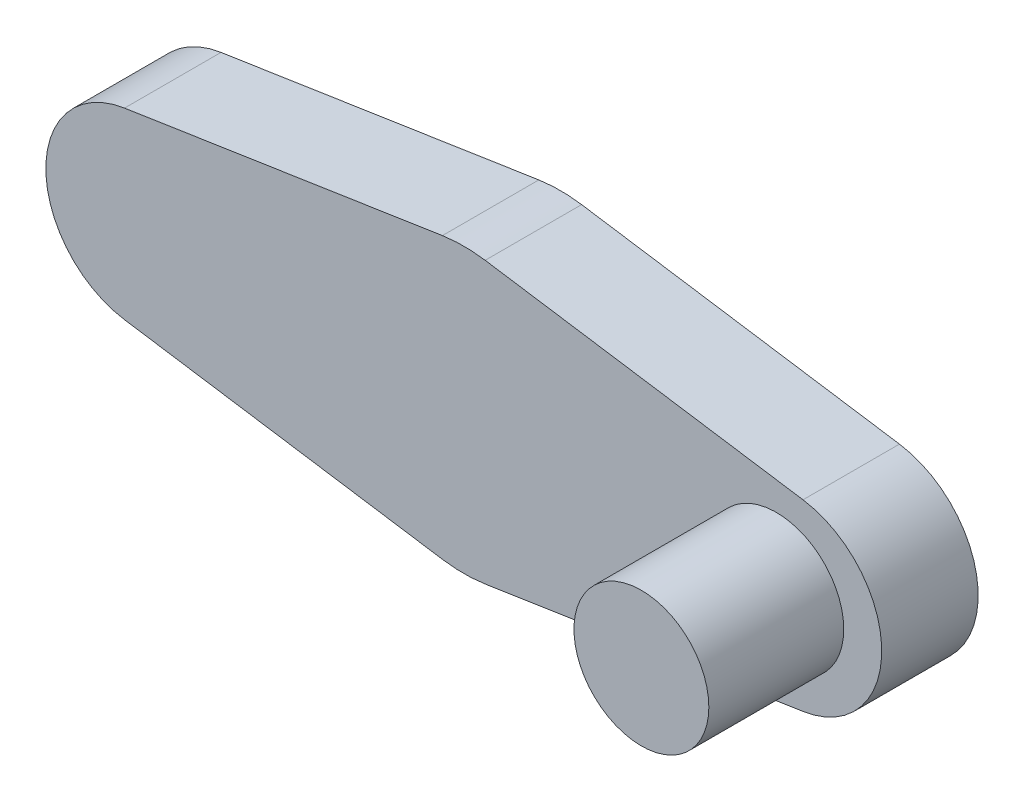
ISO-10303-21;
HEADER;
FILE_DESCRIPTION(('STEP AP214'),'2;1');
FILE_NAME('part.step','',(''),(''),'','','');
FILE_SCHEMA(('AUTOMOTIVE_DESIGN { 1 0 10303 214 1 1 1 1 }'));
ENDSEC;
DATA;
#1=APPLICATION_CONTEXT('core data for automotive mechanical design processes');
#2=APPLICATION_PROTOCOL_DEFINITION('international standard','automotive_design',2000,#1);
#3=PRODUCT_CONTEXT('',#1,'mechanical');
#4=PRODUCT('Part','Part','',(#3));
#5=PRODUCT_RELATED_PRODUCT_CATEGORY('part','',(#4));
#6=PRODUCT_DEFINITION_FORMATION('','',#4);
#7=PRODUCT_DEFINITION_CONTEXT('part definition',#1,'design');
#8=PRODUCT_DEFINITION('design','',#6,#7);
#9=PRODUCT_DEFINITION_SHAPE('','',#8);
#10=(LENGTH_UNIT() NAMED_UNIT(*) SI_UNIT(.MILLI.,.METRE.));
#11=(NAMED_UNIT(*) PLANE_ANGLE_UNIT() SI_UNIT($,.RADIAN.));
#12=(NAMED_UNIT(*) SI_UNIT($,.STERADIAN.) SOLID_ANGLE_UNIT());
#13=UNCERTAINTY_MEASURE_WITH_UNIT(LENGTH_MEASURE(1.E-05),#10,'distance_accuracy_value','');
#14=(GEOMETRIC_REPRESENTATION_CONTEXT(3) GLOBAL_UNCERTAINTY_ASSIGNED_CONTEXT((#13)) GLOBAL_UNIT_ASSIGNED_CONTEXT((#10,
#11,#12)) REPRESENTATION_CONTEXT('',''));
#15=CARTESIAN_POINT('',(0.,0.,0.));
#16=DIRECTION('',(0.,0.,1.));
#17=DIRECTION('',(1.,0.,0.));
#18=AXIS2_PLACEMENT_3D('',#15,#16,#17);
#19=CARTESIAN_POINT('',(-0.509415328671595,-3.3334105627571,2.));
#20=DIRECTION('',(-0.151067206207441,-0.988523494515269,0.));
#21=DIRECTION('',(0.988523494515269,-0.151067206207441,0.));
#22=AXIS2_PLACEMENT_3D('',#19,#20,#21);
#23=PLANE('',#22);
#24=DIRECTION('',(-0.988523494515269,0.151067206207441,0.));
#25=VECTOR('',#24,1.);
#26=CARTESIAN_POINT('',(-0.509415328671595,-3.3334105627571,0.));
#27=LINE('',#26,#25);
#28=CARTESIAN_POINT('',(4.42533710233228,-4.08754464982064,0.));
#29=VERTEX_POINT('',#28);
#30=CARTESIAN_POINT('',(-10.5365026242203,-1.80106047442719,0.));
#31=VERTEX_POINT('',#30);
#32=EDGE_CURVE('E135',#29,#31,#27,.T.);
#33=ORIENTED_EDGE('',*,*,#32,.T.);
#34=DIRECTION('',(0.,0.,-1.));
#35=VECTOR('',#34,1.);
#36=CARTESIAN_POINT('',(-10.5365026242203,-1.80106047442719,2.));
#37=LINE('',#36,#35);
#38=CARTESIAN_POINT('',(-10.5365026242203,-1.80106047442719,2.));
#39=VERTEX_POINT('',#38);
#40=EDGE_CURVE('E11',#39,#31,#37,.T.);
#41=ORIENTED_EDGE('',*,*,#40,.F.);
#42=DIRECTION('',(-0.988523494515269,0.151067206207441,0.));
#43=VECTOR('',#42,1.);
#44=CARTESIAN_POINT('',(-0.509415328671595,-3.3334105627571,2.));
#45=LINE('',#44,#43);
#46=CARTESIAN_POINT('',(4.42533710233228,-4.08754464982064,2.));
#47=VERTEX_POINT('',#46);
#48=EDGE_CURVE('E136',#47,#39,#45,.T.);
#49=ORIENTED_EDGE('',*,*,#48,.F.);
#50=DIRECTION('',(0.,0.,-1.));
#51=VECTOR('',#50,1.);
#52=CARTESIAN_POINT('',(4.42533710233228,-4.08754464982064,2.));
#53=LINE('',#52,#51);
#54=EDGE_CURVE('E121',#47,#29,#53,.T.);
#55=ORIENTED_EDGE('',*,*,#54,.T.);
#56=EDGE_LOOP('',(#33,#41,#49,#55));
#57=FACE_BOUND('',#56,.T.);
#58=ADVANCED_FACE('F41',(#57),#23,.F.);
#59=CARTESIAN_POINT('',(-10.2609482374131,0.00205743722317206,2.));
#60=DIRECTION('',(0.,0.,-1.));
#61=DIRECTION('',(-1.,0.,0.));
#62=AXIS2_PLACEMENT_3D('',#59,#60,#61);
#63=CYLINDRICAL_SURFACE('',#62,1.82405165042085);
#64=CARTESIAN_POINT('',(-10.2609482374131,0.00205743722317206,0.));
#65=DIRECTION('',(0.,0.,1.));
#66=DIRECTION('',(1.,0.,0.));
#67=AXIS2_PLACEMENT_3D('',#64,#65,#66);
#68=CIRCLE('',#67,1.82405165042085);
#69=CARTESIAN_POINT('',(-10.5360180196135,1.80524934002311,0.));
#70=VERTEX_POINT('',#69);
#71=EDGE_CURVE('E213',#31,#70,#68,.F.);
#72=ORIENTED_EDGE('',*,*,#71,.T.);
#73=DIRECTION('',(0.,0.,-1.));
#74=VECTOR('',#73,1.);
#75=CARTESIAN_POINT('',(-10.5360180196135,1.80524934002311,2.));
#76=LINE('',#75,#74);
#77=CARTESIAN_POINT('',(-10.5360180196135,1.80524934002311,2.));
#78=VERTEX_POINT('',#77);
#79=EDGE_CURVE('E51',#78,#70,#76,.T.);
#80=ORIENTED_EDGE('',*,*,#79,.F.);
#81=CARTESIAN_POINT('',(-10.2609482374131,0.00205743722317206,2.));
#82=DIRECTION('',(0.,0.,1.));
#83=DIRECTION('',(1.,0.,0.));
#84=AXIS2_PLACEMENT_3D('',#81,#82,#83);
#85=CIRCLE('',#84,1.82405165042085);
#86=EDGE_CURVE('E139',#39,#78,#85,.F.);
#87=ORIENTED_EDGE('',*,*,#86,.F.);
#88=ORIENTED_EDGE('',*,*,#40,.T.);
#89=EDGE_LOOP('',(#72,#80,#87,#88));
#90=FACE_BOUND('',#89,.T.);
#91=ADVANCED_FACE('F254',(#90),#63,.F.);
#92=CARTESIAN_POINT('',(-0.508721767831144,3.33487366439654,2.));
#93=DIRECTION('',(-0.150801531380359,0.988564058689845,0.));
#94=DIRECTION('',(-0.988564058689845,-0.150801531380359,0.));
#95=AXIS2_PLACEMENT_3D('',#92,#93,#94);
#96=PLANE('',#95);
#97=DIRECTION('',(0.988564058689845,0.150801531380359,0.));
#98=VECTOR('',#97,1.);
#99=CARTESIAN_POINT('',(-0.508721767831144,3.33487366439654,0.));
#100=LINE('',#99,#98);
#101=CARTESIAN_POINT('',(4.42643566774227,4.08771238268251,0.));
#102=VERTEX_POINT('',#101);
#103=EDGE_CURVE('E215',#70,#102,#100,.T.);
#104=ORIENTED_EDGE('',*,*,#103,.T.);
#105=DIRECTION('',(0.,0.,-1.));
#106=VECTOR('',#105,1.);
#107=CARTESIAN_POINT('',(4.42643566774227,4.08771238268251,2.));
#108=LINE('',#107,#106);
#109=CARTESIAN_POINT('',(4.42643566774227,4.08771238268251,2.));
#110=VERTEX_POINT('',#109);
#111=EDGE_CURVE('E149',#110,#102,#108,.T.);
#112=ORIENTED_EDGE('',*,*,#111,.F.);
#113=DIRECTION('',(0.988564058689845,0.150801531380359,0.));
#114=VECTOR('',#113,1.);
#115=CARTESIAN_POINT('',(-0.508721767831144,3.33487366439654,2.));
#116=LINE('',#115,#114);
#117=EDGE_CURVE('E251',#78,#110,#116,.T.);
#118=ORIENTED_EDGE('',*,*,#117,.F.);
#119=ORIENTED_EDGE('',*,*,#79,.T.);
#120=EDGE_LOOP('',(#104,#112,#118,#119));
#121=FACE_BOUND('',#120,.T.);
#122=ADVANCED_FACE('F245',(#121),#96,.F.);
#123=CARTESIAN_POINT('',(5.05000000000001,0.,2.));
#124=DIRECTION('',(0.,0.,-1.));
#125=DIRECTION('',(-1.,0.,0.));
#126=AXIS2_PLACEMENT_3D('',#123,#124,#125);
#127=CYLINDRICAL_SURFACE('',#126,4.135);
#128=CARTESIAN_POINT('',(5.05000000000001,0.,0.));
#129=DIRECTION('',(0.,0.,1.));
#130=DIRECTION('',(1.,0.,0.));
#131=AXIS2_PLACEMENT_3D('',#128,#129,#130);
#132=CIRCLE('',#131,4.135);
#133=CARTESIAN_POINT('',(5.67356433225773,4.08771238268252,0.));
#134=VERTEX_POINT('',#133);
#135=EDGE_CURVE('E218',#134,#102,#132,.T.);
#136=ORIENTED_EDGE('',*,*,#135,.F.);
#137=DIRECTION('',(0.,0.,-1.));
#138=VECTOR('',#137,1.);
#139=CARTESIAN_POINT('',(5.67356433225773,4.08771238268252,2.));
#140=LINE('',#139,#138);
#141=CARTESIAN_POINT('',(5.67356433225773,4.08771238268252,2.));
#142=VERTEX_POINT('',#141);
#143=EDGE_CURVE('E147',#142,#134,#140,.T.);
#144=ORIENTED_EDGE('',*,*,#143,.F.);
#145=CARTESIAN_POINT('',(5.05000000000001,0.,2.));
#146=DIRECTION('',(0.,0.,1.));
#147=DIRECTION('',(1.,0.,0.));
#148=AXIS2_PLACEMENT_3D('',#145,#146,#147);
#149=CIRCLE('',#148,4.135);
#150=EDGE_CURVE('E318',#142,#110,#149,.T.);
#151=ORIENTED_EDGE('',*,*,#150,.T.);
#152=ORIENTED_EDGE('',*,*,#111,.T.);
#153=EDGE_LOOP('',(#136,#144,#151,#152));
#154=FACE_BOUND('',#153,.T.);
#155=ADVANCED_FACE('F241',(#154),#127,.F.);
#156=CARTESIAN_POINT('',(0.738406896684348,4.84055110096841,2.));
#157=DIRECTION('',(-0.150801531380345,-0.988564058689847,0.));
#158=DIRECTION('',(0.988564058689847,-0.150801531380345,0.));
#159=AXIS2_PLACEMENT_3D('',#156,#157,#158);
#160=PLANE('',#159);
#161=DIRECTION('',(-0.988564058689847,0.150801531380345,0.));
#162=VECTOR('',#161,1.);
#163=CARTESIAN_POINT('',(0.738406896684348,4.84055110096841,0.));
#164=LINE('',#163,#162);
#165=CARTESIAN_POINT('',(20.6360180196135,1.80524934002333,0.));
#166=VERTEX_POINT('',#165);
#167=EDGE_CURVE('E221',#166,#134,#164,.T.);
#168=ORIENTED_EDGE('',*,*,#167,.F.);
#169=DIRECTION('',(0.,0.,-1.));
#170=VECTOR('',#169,1.);
#171=CARTESIAN_POINT('',(20.6360180196135,1.80524934002333,2.));
#172=LINE('',#171,#170);
#173=CARTESIAN_POINT('',(20.6360180196135,1.80524934002333,2.));
#174=VERTEX_POINT('',#173);
#175=EDGE_CURVE('E145',#174,#166,#172,.T.);
#176=ORIENTED_EDGE('',*,*,#175,.F.);
#177=DIRECTION('',(-0.988564058689847,0.150801531380345,0.));
#178=VECTOR('',#177,1.);
#179=CARTESIAN_POINT('',(0.738406896684348,4.84055110096841,2.));
#180=LINE('',#179,#178);
#181=EDGE_CURVE('E238',#174,#142,#180,.T.);
#182=ORIENTED_EDGE('',*,*,#181,.T.);
#183=ORIENTED_EDGE('',*,*,#143,.T.);
#184=EDGE_LOOP('',(#168,#176,#182,#183));
#185=FACE_BOUND('',#184,.T.);
#186=ADVANCED_FACE('F233',(#185),#160,.T.);
#187=CARTESIAN_POINT('',(20.3609482374132,0.00205743722338716,2.));
#188=DIRECTION('',(0.,0.,-1.));
#189=DIRECTION('',(-1.,0.,0.));
#190=AXIS2_PLACEMENT_3D('',#187,#188,#189);
#191=CYLINDRICAL_SURFACE('',#190,1.82405165042085);
#192=CARTESIAN_POINT('',(20.3609482374132,0.00205743722338716,0.));
#193=DIRECTION('',(0.,0.,1.));
#194=DIRECTION('',(1.,0.,0.));
#195=AXIS2_PLACEMENT_3D('',#192,#193,#194);
#196=CIRCLE('',#195,1.82405165042085);
#197=CARTESIAN_POINT('',(20.6365026242203,-1.80106047442697,0.));
#198=VERTEX_POINT('',#197);
#199=EDGE_CURVE('E130',#198,#166,#196,.T.);
#200=ORIENTED_EDGE('',*,*,#199,.F.);
#201=DIRECTION('',(0.,0.,-1.));
#202=VECTOR('',#201,1.);
#203=CARTESIAN_POINT('',(20.6365026242203,-1.80106047442697,2.));
#204=LINE('',#203,#202);
#205=CARTESIAN_POINT('',(20.6365026242203,-1.80106047442697,2.));
#206=VERTEX_POINT('',#205);
#207=EDGE_CURVE('E120',#206,#198,#204,.T.);
#208=ORIENTED_EDGE('',*,*,#207,.F.);
#209=CARTESIAN_POINT('',(20.3609482374132,0.00205743722338716,2.));
#210=DIRECTION('',(0.,0.,1.));
#211=DIRECTION('',(1.,0.,0.));
#212=AXIS2_PLACEMENT_3D('',#209,#210,#211);
#213=CIRCLE('',#212,1.82405165042085);
#214=EDGE_CURVE('E230',#206,#174,#213,.T.);
#215=ORIENTED_EDGE('',*,*,#214,.T.);
#216=ORIENTED_EDGE('',*,*,#175,.T.);
#217=EDGE_LOOP('',(#200,#208,#215,#216));
#218=FACE_BOUND('',#217,.T.);
#219=ADVANCED_FACE('F225',(#218),#191,.F.);
#220=CARTESIAN_POINT('',(0.739910466664021,-4.84167873688423,2.));
#221=DIRECTION('',(-0.151067206207455,0.988523494515267,0.));
#222=DIRECTION('',(-0.988523494515267,-0.151067206207455,0.));
#223=AXIS2_PLACEMENT_3D('',#220,#221,#222);
#224=PLANE('',#223);
#225=DIRECTION('',(0.988523494515267,0.151067206207455,0.));
#226=VECTOR('',#225,1.);
#227=CARTESIAN_POINT('',(0.739910466664021,-4.84167873688423,0.));
#228=LINE('',#227,#226);
#229=CARTESIAN_POINT('',(5.67466289766783,-4.08754464982063,0.));
#230=VERTEX_POINT('',#229);
#231=EDGE_CURVE('E124',#230,#198,#228,.T.);
#232=ORIENTED_EDGE('',*,*,#231,.F.);
#233=DIRECTION('',(0.,0.,-1.));
#234=VECTOR('',#233,1.);
#235=CARTESIAN_POINT('',(5.67466289766783,-4.08754464982063,2.));
#236=LINE('',#235,#234);
#237=CARTESIAN_POINT('',(5.67466289766783,-4.08754464982063,2.));
#238=VERTEX_POINT('',#237);
#239=EDGE_CURVE('E112',#238,#230,#236,.T.);
#240=ORIENTED_EDGE('',*,*,#239,.F.);
#241=DIRECTION('',(0.988523494515267,0.151067206207455,0.));
#242=VECTOR('',#241,1.);
#243=CARTESIAN_POINT('',(0.739910466664021,-4.84167873688423,2.));
#244=LINE('',#243,#242);
#245=EDGE_CURVE('E59',#238,#206,#244,.T.);
#246=ORIENTED_EDGE('',*,*,#245,.T.);
#247=ORIENTED_EDGE('',*,*,#207,.T.);
#248=EDGE_LOOP('',(#232,#240,#246,#247));
#249=FACE_BOUND('',#248,.T.);
#250=ADVANCED_FACE('F125',(#249),#224,.T.);
#251=CARTESIAN_POINT('',(-10.2609482374131,0.00205743722317206,2.));
#252=DIRECTION('',(0.,0.,-1.));
#253=DIRECTION('',(-1.,0.,0.));
#254=AXIS2_PLACEMENT_3D('',#251,#252,#253);
#255=CYLINDRICAL_SURFACE('',#254,4.36405165042085);
#256=CARTESIAN_POINT('',(-10.2609482374131,0.00205743722317206,0.));
#257=DIRECTION('',(0.,0.,1.));
#258=DIRECTION('',(1.,0.,0.));
#259=AXIS2_PLACEMENT_3D('',#256,#257,#258);
#260=CIRCLE('',#259,4.36405165042085);
#261=CARTESIAN_POINT('',(-10.9202133279872,-4.31191015049597,0.));
#262=VERTEX_POINT('',#261);
#263=CARTESIAN_POINT('',(-10.9190539093196,4.31620204909532,0.));
#264=VERTEX_POINT('',#263);
#265=EDGE_CURVE('E188',#262,#264,#260,.F.);
#266=ORIENTED_EDGE('',*,*,#265,.F.);
#267=DIRECTION('',(0.,0.,-1.));
#268=VECTOR('',#267,1.);
#269=CARTESIAN_POINT('',(-10.9202133279872,-4.31191015049597,2.));
#270=LINE('',#269,#268);
#271=CARTESIAN_POINT('',(-10.9202133279872,-4.31191015049597,4.54));
#272=VERTEX_POINT('',#271);
#273=EDGE_CURVE('E45',#272,#262,#270,.T.);
#274=ORIENTED_EDGE('',*,*,#273,.F.);
#275=CARTESIAN_POINT('',(-10.2609482374131,0.00205743722317206,4.54));
#276=DIRECTION('',(0.,0.,1.));
#277=DIRECTION('',(1.,0.,0.));
#278=AXIS2_PLACEMENT_3D('',#275,#276,#277);
#279=CIRCLE('',#278,4.36405165042085);
#280=CARTESIAN_POINT('',(-10.9190539093196,4.31620204909532,4.54));
#281=VERTEX_POINT('',#280);
#282=EDGE_CURVE('E289',#281,#272,#279,.T.);
#283=ORIENTED_EDGE('',*,*,#282,.F.);
#284=DIRECTION('',(0.,0.,-1.));
#285=VECTOR('',#284,1.);
#286=CARTESIAN_POINT('',(-10.9190539093196,4.31620204909532,2.));
#287=LINE('',#286,#285);
#288=EDGE_CURVE('E153',#281,#264,#287,.T.);
#289=ORIENTED_EDGE('',*,*,#288,.T.);
#290=EDGE_LOOP('',(#266,#274,#283,#289));
#291=FACE_BOUND('',#290,.T.);
#292=ADVANCED_FACE('F43',(#291),#255,.T.);
#293=CARTESIAN_POINT('',(-0.893126032438493,-5.84426023882588,2.));
#294=DIRECTION('',(-0.151067206207441,-0.988523494515269,0.));
#295=DIRECTION('',(0.988523494515269,-0.151067206207441,0.));
#296=AXIS2_PLACEMENT_3D('',#293,#294,#295);
#297=PLANE('',#296);
#298=DIRECTION('',(-0.988523494515269,0.151067206207441,0.));
#299=VECTOR('',#298,1.);
#300=CARTESIAN_POINT('',(-0.893126032438493,-5.84426023882588,0.));
#301=LINE('',#300,#299);
#302=CARTESIAN_POINT('',(4.04162639856539,-6.59839432588942,0.));
#303=VERTEX_POINT('',#302);
#304=EDGE_CURVE('E180',#303,#262,#301,.T.);
#305=ORIENTED_EDGE('',*,*,#304,.F.);
#306=DIRECTION('',(0.,0.,-1.));
#307=VECTOR('',#306,1.);
#308=CARTESIAN_POINT('',(4.04162639856539,-6.59839432588942,2.));
#309=LINE('',#308,#307);
#310=CARTESIAN_POINT('',(4.04162639856538,-6.59839432588942,4.54));
#311=VERTEX_POINT('',#310);
#312=EDGE_CURVE('E168',#311,#303,#309,.T.);
#313=ORIENTED_EDGE('',*,*,#312,.F.);
#314=DIRECTION('',(0.988523494515269,-0.151067206207441,0.));
#315=VECTOR('',#314,1.);
#316=CARTESIAN_POINT('',(-0.893126032438493,-5.84426023882588,4.54));
#317=LINE('',#316,#315);
#318=EDGE_CURVE('E183',#272,#311,#317,.T.);
#319=ORIENTED_EDGE('',*,*,#318,.F.);
#320=ORIENTED_EDGE('',*,*,#273,.T.);
#321=EDGE_LOOP('',(#305,#313,#319,#320));
#322=FACE_BOUND('',#321,.T.);
#323=ADVANCED_FACE('F178',(#322),#297,.T.);
#324=CARTESIAN_POINT('',(5.05000000000001,0.,2.));
#325=DIRECTION('',(0.,0.,-1.));
#326=DIRECTION('',(-1.,0.,0.));
#327=AXIS2_PLACEMENT_3D('',#324,#325,#326);
#328=CYLINDRICAL_SURFACE('',#327,6.675);
#329=CARTESIAN_POINT('',(5.05000000000001,0.,0.));
#330=DIRECTION('',(0.,0.,1.));
#331=DIRECTION('',(1.,0.,0.));
#332=AXIS2_PLACEMENT_3D('',#329,#330,#331);
#333=CIRCLE('',#332,6.675);
#334=CARTESIAN_POINT('',(6.05837360143477,-6.59839432588941,0.));
#335=VERTEX_POINT('',#334);
#336=EDGE_CURVE('E196',#303,#335,#333,.T.);
#337=ORIENTED_EDGE('',*,*,#336,.T.);
#338=DIRECTION('',(0.,0.,-1.));
#339=VECTOR('',#338,1.);
#340=CARTESIAN_POINT('',(6.05837360143477,-6.59839432588941,2.));
#341=LINE('',#340,#339);
#342=CARTESIAN_POINT('',(6.05837360143477,-6.59839432588941,4.54));
#343=VERTEX_POINT('',#342);
#344=EDGE_CURVE('E166',#343,#335,#341,.T.);
#345=ORIENTED_EDGE('',*,*,#344,.F.);
#346=CARTESIAN_POINT('',(5.05000000000001,0.,4.54));
#347=DIRECTION('',(0.,0.,1.));
#348=DIRECTION('',(1.,0.,0.));
#349=AXIS2_PLACEMENT_3D('',#346,#347,#348);
#350=CIRCLE('',#349,6.675);
#351=EDGE_CURVE('E304',#311,#343,#350,.T.);
#352=ORIENTED_EDGE('',*,*,#351,.F.);
#353=ORIENTED_EDGE('',*,*,#312,.T.);
#354=EDGE_LOOP('',(#337,#345,#352,#353));
#355=FACE_BOUND('',#354,.T.);
#356=ADVANCED_FACE('F360',(#355),#328,.T.);
#357=CARTESIAN_POINT('',(1.12362117043096,-7.35252841295301,2.));
#358=DIRECTION('',(-0.151067206207455,0.988523494515267,0.));
#359=DIRECTION('',(-0.988523494515267,-0.151067206207455,0.));
#360=AXIS2_PLACEMENT_3D('',#357,#358,#359);
#361=PLANE('',#360);
#362=DIRECTION('',(0.988523494515267,0.151067206207455,0.));
#363=VECTOR('',#362,1.);
#364=CARTESIAN_POINT('',(1.12362117043096,-7.35252841295301,0.));
#365=LINE('',#364,#363);
#366=CARTESIAN_POINT('',(21.0202133279873,-4.31191015049575,0.));
#367=VERTEX_POINT('',#366);
#368=EDGE_CURVE('E198',#335,#367,#365,.T.);
#369=ORIENTED_EDGE('',*,*,#368,.T.);
#370=DIRECTION('',(0.,0.,-1.));
#371=VECTOR('',#370,1.);
#372=CARTESIAN_POINT('',(21.0202133279873,-4.31191015049575,2.));
#373=LINE('',#372,#371);
#374=CARTESIAN_POINT('',(21.0202133279873,-4.31191015049575,4.54));
#375=VERTEX_POINT('',#374);
#376=EDGE_CURVE('E163',#375,#367,#373,.T.);
#377=ORIENTED_EDGE('',*,*,#376,.F.);
#378=DIRECTION('',(0.988523494515267,0.151067206207455,0.));
#379=VECTOR('',#378,1.);
#380=CARTESIAN_POINT('',(1.12362117043096,-7.35252841295301,4.54));
#381=LINE('',#380,#379);
#382=EDGE_CURVE('E307',#343,#375,#381,.T.);
#383=ORIENTED_EDGE('',*,*,#382,.F.);
#384=ORIENTED_EDGE('',*,*,#344,.T.);
#385=EDGE_LOOP('',(#369,#377,#383,#384));
#386=FACE_BOUND('',#385,.T.);
#387=ADVANCED_FACE('F356',(#386),#361,.F.);
#388=CARTESIAN_POINT('',(20.3609482374132,0.00205743722338716,2.));
#389=DIRECTION('',(0.,0.,-1.));
#390=DIRECTION('',(-1.,0.,0.));
#391=AXIS2_PLACEMENT_3D('',#388,#389,#390);
#392=CYLINDRICAL_SURFACE('',#391,4.36405165042085);
#393=CARTESIAN_POINT('',(20.3609482374132,0.00205743722338716,0.));
#394=DIRECTION('',(0.,0.,1.));
#395=DIRECTION('',(1.,0.,0.));
#396=AXIS2_PLACEMENT_3D('',#393,#394,#395);
#397=CIRCLE('',#396,4.36405165042085);
#398=CARTESIAN_POINT('',(21.0190539093196,4.31620204909554,0.));
#399=VERTEX_POINT('',#398);
#400=EDGE_CURVE('E203',#367,#399,#397,.T.);
#401=ORIENTED_EDGE('',*,*,#400,.T.);
#402=DIRECTION('',(0.,0.,-1.));
#403=VECTOR('',#402,1.);
#404=CARTESIAN_POINT('',(21.0190539093196,4.31620204909554,2.));
#405=LINE('',#404,#403);
#406=CARTESIAN_POINT('',(21.0190539093196,4.31620204909554,4.54));
#407=VERTEX_POINT('',#406);
#408=EDGE_CURVE('E160',#407,#399,#405,.T.);
#409=ORIENTED_EDGE('',*,*,#408,.F.);
#410=CARTESIAN_POINT('',(20.3609482374132,0.00205743722338716,4.54));
#411=DIRECTION('',(0.,0.,1.));
#412=DIRECTION('',(1.,0.,0.));
#413=AXIS2_PLACEMENT_3D('',#410,#411,#412);
#414=CIRCLE('',#413,4.36405165042085);
#415=EDGE_CURVE('E310',#375,#407,#414,.T.);
#416=ORIENTED_EDGE('',*,*,#415,.F.);
#417=ORIENTED_EDGE('',*,*,#376,.T.);
#418=EDGE_LOOP('',(#401,#409,#416,#417));
#419=FACE_BOUND('',#418,.T.);
#420=ADVANCED_FACE('F352',(#419),#392,.T.);
#421=CARTESIAN_POINT('',(1.12144278639042,7.35150381004062,2.));
#422=DIRECTION('',(-0.150801531380345,-0.988564058689847,0.));
#423=DIRECTION('',(0.988564058689847,-0.150801531380345,0.));
#424=AXIS2_PLACEMENT_3D('',#421,#422,#423);
#425=PLANE('',#424);
#426=DIRECTION('',(-0.988564058689847,0.150801531380345,0.));
#427=VECTOR('',#426,1.);
#428=CARTESIAN_POINT('',(1.12144278639042,7.35150381004062,0.));
#429=LINE('',#428,#427);
#430=CARTESIAN_POINT('',(6.05660022196381,6.59866509175473,0.));
#431=VERTEX_POINT('',#430);
#432=EDGE_CURVE('E205',#399,#431,#429,.T.);
#433=ORIENTED_EDGE('',*,*,#432,.T.);
#434=DIRECTION('',(0.,0.,-1.));
#435=VECTOR('',#434,1.);
#436=CARTESIAN_POINT('',(6.05660022196381,6.59866509175473,2.));
#437=LINE('',#436,#435);
#438=CARTESIAN_POINT('',(6.05660022196381,6.59866509175473,4.54));
#439=VERTEX_POINT('',#438);
#440=EDGE_CURVE('E157',#439,#431,#437,.T.);
#441=ORIENTED_EDGE('',*,*,#440,.F.);
#442=DIRECTION('',(-0.988564058689847,0.150801531380345,0.));
#443=VECTOR('',#442,1.);
#444=CARTESIAN_POINT('',(1.12144278639042,7.35150381004062,4.54));
#445=LINE('',#444,#443);
#446=EDGE_CURVE('E313',#407,#439,#445,.T.);
#447=ORIENTED_EDGE('',*,*,#446,.F.);
#448=ORIENTED_EDGE('',*,*,#408,.T.);
#449=EDGE_LOOP('',(#433,#441,#447,#448));
#450=FACE_BOUND('',#449,.T.);
#451=ADVANCED_FACE('F348',(#450),#425,.F.);
#452=CARTESIAN_POINT('',(5.05000000000001,0.,2.));
#453=DIRECTION('',(0.,0.,-1.));
#454=DIRECTION('',(-1.,0.,0.));
#455=AXIS2_PLACEMENT_3D('',#452,#453,#454);
#456=CYLINDRICAL_SURFACE('',#455,6.675);
#457=CARTESIAN_POINT('',(5.05000000000001,0.,0.));
#458=DIRECTION('',(0.,0.,1.));
#459=DIRECTION('',(1.,0.,0.));
#460=AXIS2_PLACEMENT_3D('',#457,#458,#459);
#461=CIRCLE('',#460,6.675);
#462=CARTESIAN_POINT('',(4.04339977803616,6.59866509175472,0.));
#463=VERTEX_POINT('',#462);
#464=EDGE_CURVE('E207',#431,#463,#461,.T.);
#465=ORIENTED_EDGE('',*,*,#464,.T.);
#466=DIRECTION('',(0.,0.,-1.));
#467=VECTOR('',#466,1.);
#468=CARTESIAN_POINT('',(4.04339977803616,6.59866509175472,2.));
#469=LINE('',#468,#467);
#470=CARTESIAN_POINT('',(4.04339977803616,6.59866509175472,4.54));
#471=VERTEX_POINT('',#470);
#472=EDGE_CURVE('E155',#471,#463,#469,.T.);
#473=ORIENTED_EDGE('',*,*,#472,.F.);
#474=CARTESIAN_POINT('',(5.05000000000001,0.,4.54));
#475=DIRECTION('',(0.,0.,1.));
#476=DIRECTION('',(1.,0.,0.));
#477=AXIS2_PLACEMENT_3D('',#474,#475,#476);
#478=CIRCLE('',#477,6.675);
#479=EDGE_CURVE('E193',#439,#471,#478,.T.);
#480=ORIENTED_EDGE('',*,*,#479,.F.);
#481=ORIENTED_EDGE('',*,*,#440,.T.);
#482=EDGE_LOOP('',(#465,#473,#480,#481));
#483=FACE_BOUND('',#482,.T.);
#484=ADVANCED_FACE('F345',(#483),#456,.T.);
#485=CARTESIAN_POINT('',(-0.891757657537256,5.84582637346875,2.));
#486=DIRECTION('',(-0.150801531380359,0.988564058689845,0.));
#487=DIRECTION('',(-0.988564058689845,-0.150801531380359,0.));
#488=AXIS2_PLACEMENT_3D('',#485,#486,#487);
#489=PLANE('',#488);
#490=DIRECTION('',(0.988564058689845,0.150801531380359,0.));
#491=VECTOR('',#490,1.);
#492=CARTESIAN_POINT('',(-0.891757657537256,5.84582637346875,0.));
#493=LINE('',#492,#491);
#494=EDGE_CURVE('E210',#264,#463,#493,.T.);
#495=ORIENTED_EDGE('',*,*,#494,.F.);
#496=ORIENTED_EDGE('',*,*,#288,.F.);
#497=DIRECTION('',(-0.988564058689845,-0.150801531380359,0.));
#498=VECTOR('',#497,1.);
#499=CARTESIAN_POINT('',(-0.891757657537256,5.84582637346875,4.54));
#500=LINE('',#499,#498);
#501=EDGE_CURVE('E288',#471,#281,#500,.T.);
#502=ORIENTED_EDGE('',*,*,#501,.F.);
#503=ORIENTED_EDGE('',*,*,#472,.T.);
#504=EDGE_LOOP('',(#495,#496,#502,#503));
#505=FACE_BOUND('',#504,.T.);
#506=ADVANCED_FACE('F286',(#505),#489,.T.);
#507=CARTESIAN_POINT('',(5.05000000000001,0.,2.));
#508=DIRECTION('',(0.,0.,-1.));
#509=DIRECTION('',(-1.,0.,0.));
#510=AXIS2_PLACEMENT_3D('',#507,#508,#509);
#511=CYLINDRICAL_SURFACE('',#510,4.135);
#512=CARTESIAN_POINT('',(5.05000000000001,0.,0.));
#513=DIRECTION('',(0.,0.,1.));
#514=DIRECTION('',(1.,0.,0.));
#515=AXIS2_PLACEMENT_3D('',#512,#513,#514);
#516=CIRCLE('',#515,4.135);
#517=EDGE_CURVE('E117',#29,#230,#516,.T.);
#518=ORIENTED_EDGE('',*,*,#517,.F.);
#519=ORIENTED_EDGE('',*,*,#54,.F.);
#520=CARTESIAN_POINT('',(5.05000000000001,0.,2.));
#521=DIRECTION('',(0.,0.,1.));
#522=DIRECTION('',(1.,0.,0.));
#523=AXIS2_PLACEMENT_3D('',#520,#521,#522);
#524=CIRCLE('',#523,4.135);
#525=EDGE_CURVE('E118',#47,#238,#524,.T.);
#526=ORIENTED_EDGE('',*,*,#525,.T.);
#527=ORIENTED_EDGE('',*,*,#239,.T.);
#528=EDGE_LOOP('',(#518,#519,#526,#527));
#529=FACE_BOUND('',#528,.T.);
#530=ADVANCED_FACE('F114',(#529),#511,.F.);
#531=CARTESIAN_POINT('',(0.,0.,0.));
#532=DIRECTION('',(0.,0.,1.));
#533=DIRECTION('',(1.,0.,0.));
#534=AXIS2_PLACEMENT_3D('',#531,#532,#533);
#535=PLANE('',#534);
#536=ORIENTED_EDGE('',*,*,#265,.T.);
#537=ORIENTED_EDGE('',*,*,#494,.T.);
#538=ORIENTED_EDGE('',*,*,#464,.F.);
#539=ORIENTED_EDGE('',*,*,#432,.F.);
#540=ORIENTED_EDGE('',*,*,#400,.F.);
#541=ORIENTED_EDGE('',*,*,#368,.F.);
#542=ORIENTED_EDGE('',*,*,#336,.F.);
#543=ORIENTED_EDGE('',*,*,#304,.T.);
#544=EDGE_LOOP('',(#536,#537,#538,#539,#540,#541,#542,#543));
#545=FACE_BOUND('',#544,.T.);
#546=ORIENTED_EDGE('',*,*,#32,.F.);
#547=ORIENTED_EDGE('',*,*,#517,.T.);
#548=ORIENTED_EDGE('',*,*,#231,.T.);
#549=ORIENTED_EDGE('',*,*,#199,.T.);
#550=ORIENTED_EDGE('',*,*,#167,.T.);
#551=ORIENTED_EDGE('',*,*,#135,.T.);
#552=ORIENTED_EDGE('',*,*,#103,.F.);
#553=ORIENTED_EDGE('',*,*,#71,.F.);
#554=EDGE_LOOP('',(#546,#547,#548,#549,#550,#551,#552,#553));
#555=FACE_BOUND('',#554,.T.);
#556=ADVANCED_FACE('F133',(#545,#555),#535,.F.);
#557=CARTESIAN_POINT('',(0.,0.,2.));
#558=DIRECTION('',(0.,0.,1.));
#559=DIRECTION('',(1.,0.,0.));
#560=AXIS2_PLACEMENT_3D('',#557,#558,#559);
#561=PLANE('',#560);
#562=ORIENTED_EDGE('',*,*,#525,.F.);
#563=ORIENTED_EDGE('',*,*,#48,.T.);
#564=ORIENTED_EDGE('',*,*,#86,.T.);
#565=ORIENTED_EDGE('',*,*,#117,.T.);
#566=ORIENTED_EDGE('',*,*,#150,.F.);
#567=ORIENTED_EDGE('',*,*,#181,.F.);
#568=ORIENTED_EDGE('',*,*,#214,.F.);
#569=ORIENTED_EDGE('',*,*,#245,.F.);
#570=EDGE_LOOP('',(#562,#563,#564,#565,#566,#567,#568,#569));
#571=FACE_BOUND('',#570,.T.);
#572=ADVANCED_FACE('F322',(#571),#561,.F.);
#573=CARTESIAN_POINT('',(0.,0.,4.54));
#574=DIRECTION('',(0.,0.,1.));
#575=DIRECTION('',(1.,0.,0.));
#576=AXIS2_PLACEMENT_3D('',#573,#574,#575);
#577=PLANE('',#576);
#578=CARTESIAN_POINT('',(19.7613114684991,0.,4.54));
#579=DIRECTION('',(0.,0.,1.));
#580=DIRECTION('',(1.,0.,0.));
#581=AXIS2_PLACEMENT_3D('',#578,#579,#580);
#582=CIRCLE('',#581,3.175);
#583=CARTESIAN_POINT('',(22.9363114684991,0.,4.54));
#584=VERTEX_POINT('',#583);
#585=EDGE_CURVE('E299',#584,#584,#582,.T.);
#586=ORIENTED_EDGE('',*,*,#585,.F.);
#587=EDGE_LOOP('',(#586));
#588=FACE_BOUND('',#587,.T.);
#589=ORIENTED_EDGE('',*,*,#501,.T.);
#590=ORIENTED_EDGE('',*,*,#282,.T.);
#591=ORIENTED_EDGE('',*,*,#318,.T.);
#592=ORIENTED_EDGE('',*,*,#351,.T.);
#593=ORIENTED_EDGE('',*,*,#382,.T.);
#594=ORIENTED_EDGE('',*,*,#415,.T.);
#595=ORIENTED_EDGE('',*,*,#446,.T.);
#596=ORIENTED_EDGE('',*,*,#479,.T.);
#597=EDGE_LOOP('',(#589,#590,#591,#592,#593,#594,#595,#596));
#598=FACE_BOUND('',#597,.T.);
#599=ADVANCED_FACE('F293',(#588,#598),#577,.T.);
#600=CARTESIAN_POINT('',(19.7613114684991,0.,10.89));
#601=DIRECTION('',(0.,0.,-1.));
#602=DIRECTION('',(-1.,0.,0.));
#603=AXIS2_PLACEMENT_3D('',#600,#601,#602);
#604=CYLINDRICAL_SURFACE('',#603,3.175);
#605=CARTESIAN_POINT('',(19.7613114684991,0.,10.89));
#606=DIRECTION('',(0.,0.,1.));
#607=DIRECTION('',(1.,0.,0.));
#608=AXIS2_PLACEMENT_3D('',#605,#606,#607);
#609=CIRCLE('',#608,3.175);
#610=CARTESIAN_POINT('',(22.9363114684991,0.,10.89));
#611=VERTEX_POINT('',#610);
#612=EDGE_CURVE('E296',#611,#611,#609,.T.);
#613=ORIENTED_EDGE('',*,*,#612,.F.);
#614=EDGE_LOOP('',(#613));
#615=FACE_BOUND('',#614,.T.);
#616=ORIENTED_EDGE('',*,*,#585,.T.);
#617=EDGE_LOOP('',(#616));
#618=FACE_BOUND('',#617,.T.);
#619=ADVANCED_FACE('F329',(#615,#618),#604,.T.);
#620=CARTESIAN_POINT('',(19.7613114684991,0.,10.89));
#621=DIRECTION('',(0.,0.,1.));
#622=DIRECTION('',(1.,0.,0.));
#623=AXIS2_PLACEMENT_3D('',#620,#621,#622);
#624=PLANE('',#623);
#625=ORIENTED_EDGE('',*,*,#612,.T.);
#626=EDGE_LOOP('',(#625));
#627=FACE_BOUND('',#626,.T.);
#628=ADVANCED_FACE('F505',(#627),#624,.T.);
#629=CLOSED_SHELL('',(#58,#91,#122,#155,#186,#219,#250,#292,#323,#356,#387,#420,#451,#484,#506,
#530,#556,#572,#599,#619,#628));
#630=MANIFOLD_SOLID_BREP('B2',#629);
#631=ADVANCED_BREP_SHAPE_REPRESENTATION('',(#18,#630),#14);
#632=SHAPE_DEFINITION_REPRESENTATION(#9,#631);
ENDSEC;
END-ISO-10303-21;
